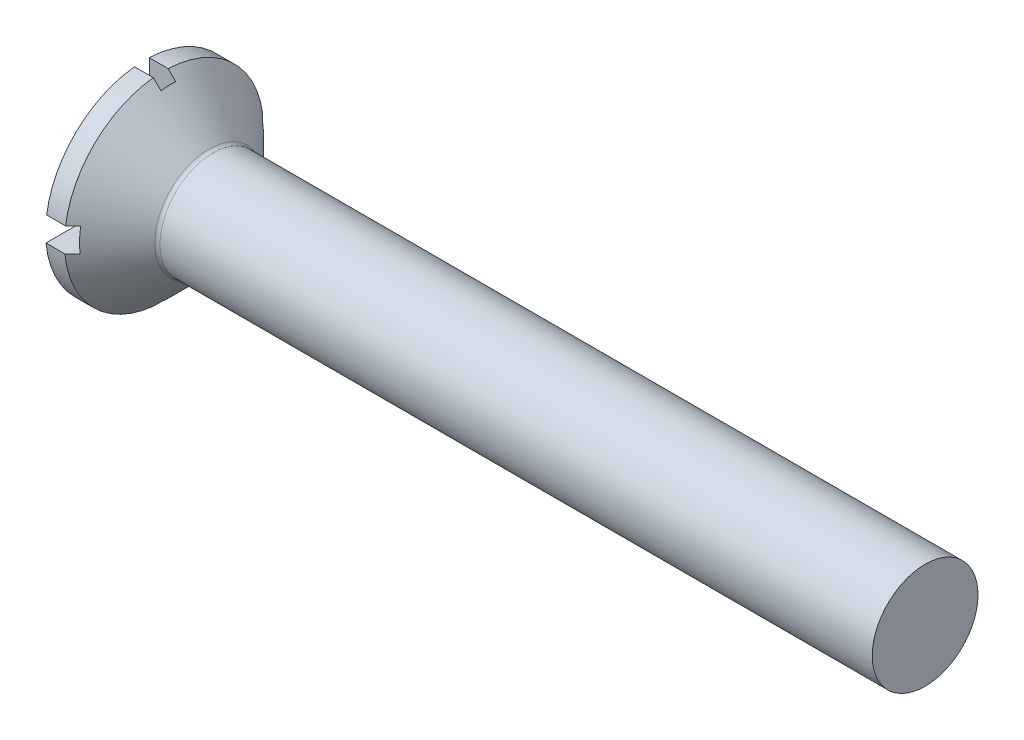
ISO-10303-21;
HEADER;
FILE_DESCRIPTION(('STEP AP214'),'2;1');
FILE_NAME('part.step','',(''),(''),'','','');
FILE_SCHEMA(('AUTOMOTIVE_DESIGN { 1 0 10303 214 1 1 1 1 }'));
ENDSEC;
DATA;
#1=APPLICATION_CONTEXT('core data for automotive mechanical design processes');
#2=APPLICATION_PROTOCOL_DEFINITION('international standard','automotive_design',2000,#1);
#3=PRODUCT_CONTEXT('',#1,'mechanical');
#4=PRODUCT('Part','Part','',(#3));
#5=PRODUCT_RELATED_PRODUCT_CATEGORY('part','',(#4));
#6=PRODUCT_DEFINITION_FORMATION('','',#4);
#7=PRODUCT_DEFINITION_CONTEXT('part definition',#1,'design');
#8=PRODUCT_DEFINITION('design','',#6,#7);
#9=PRODUCT_DEFINITION_SHAPE('','',#8);
#10=(LENGTH_UNIT() NAMED_UNIT(*) SI_UNIT(.MILLI.,.METRE.));
#11=(NAMED_UNIT(*) PLANE_ANGLE_UNIT() SI_UNIT($,.RADIAN.));
#12=(NAMED_UNIT(*) SI_UNIT($,.STERADIAN.) SOLID_ANGLE_UNIT());
#13=UNCERTAINTY_MEASURE_WITH_UNIT(LENGTH_MEASURE(1.E-05),#10,'distance_accuracy_value','');
#14=(GEOMETRIC_REPRESENTATION_CONTEXT(3) GLOBAL_UNCERTAINTY_ASSIGNED_CONTEXT((#13)) GLOBAL_UNIT_ASSIGNED_CONTEXT((#10,
#11,#12)) REPRESENTATION_CONTEXT('',''));
#15=CARTESIAN_POINT('',(0.,0.,0.));
#16=DIRECTION('',(0.,0.,1.));
#17=DIRECTION('',(1.,0.,0.));
#18=AXIS2_PLACEMENT_3D('',#15,#16,#17);
#19=CARTESIAN_POINT('',(-0.587069180985524,0.,0.));
#20=DIRECTION('',(-1.,0.,0.));
#21=DIRECTION('',(0.,0.,1.));
#22=AXIS2_PLACEMENT_3D('',#19,#20,#21);
#23=CYLINDRICAL_SURFACE('',#22,2.);
#24=CARTESIAN_POINT('',(2.56284271247462,0.,0.));
#25=DIRECTION('',(1.,0.,0.));
#26=DIRECTION('',(0.,0.,1.));
#27=AXIS2_PLACEMENT_3D('',#24,#25,#26);
#28=CIRCLE('',#27,2.);
#29=CARTESIAN_POINT('',(2.56284271247462,0.,2.));
#30=VERTEX_POINT('',#29);
#31=CARTESIAN_POINT('',(2.56284271247462,0.,-2.));
#32=VERTEX_POINT('',#31);
#33=EDGE_CURVE('E235',#30,#32,#28,.T.);
#34=ORIENTED_EDGE('',*,*,#33,.T.);
#35=DIRECTION('',(1.,0.,0.));
#36=VECTOR('',#35,1.);
#37=CARTESIAN_POINT('',(-0.587069180985524,0.,-2.));
#38=LINE('',#37,#36);
#39=CARTESIAN_POINT('',(29.5,0.,-2.));
#40=VERTEX_POINT('',#39);
#41=EDGE_CURVE('E11',#32,#40,#38,.T.);
#42=ORIENTED_EDGE('',*,*,#41,.T.);
#43=CARTESIAN_POINT('',(29.5,0.,0.));
#44=DIRECTION('',(-1.,0.,0.));
#45=DIRECTION('',(0.,0.,1.));
#46=AXIS2_PLACEMENT_3D('',#43,#44,#45);
#47=CIRCLE('',#46,2.);
#48=CARTESIAN_POINT('',(29.5,0.,2.));
#49=VERTEX_POINT('',#48);
#50=EDGE_CURVE('E276',#40,#49,#47,.T.);
#51=ORIENTED_EDGE('',*,*,#50,.T.);
#52=CARTESIAN_POINT('',(29.5,0.,0.));
#53=DIRECTION('',(-1.,0.,0.));
#54=DIRECTION('',(0.,0.,1.));
#55=AXIS2_PLACEMENT_3D('',#52,#53,#54);
#56=CIRCLE('',#55,2.);
#57=EDGE_CURVE('E272',#49,#40,#56,.T.);
#58=ORIENTED_EDGE('',*,*,#57,.T.);
#59=ORIENTED_EDGE('',*,*,#41,.F.);
#60=CARTESIAN_POINT('',(2.56284271247462,0.,0.));
#61=DIRECTION('',(1.,0.,0.));
#62=DIRECTION('',(0.,0.,1.));
#63=AXIS2_PLACEMENT_3D('',#60,#61,#62);
#64=CIRCLE('',#63,2.);
#65=EDGE_CURVE('E29',#32,#30,#64,.T.);
#66=ORIENTED_EDGE('',*,*,#65,.T.);
#67=EDGE_LOOP('',(#34,#42,#51,#58,#59,#66));
#68=FACE_BOUND('',#67,.T.);
#69=ADVANCED_FACE('F16',(#68),#23,.T.);
#70=CARTESIAN_POINT('',(2.56284271247462,0.,0.));
#71=DIRECTION('',(-1.,0.,0.));
#72=DIRECTION('',(0.,0.,1.));
#73=AXIS2_PLACEMENT_3D('',#70,#71,#72);
#74=TOROIDAL_SURFACE('',#73,2.2,0.2);
#75=CARTESIAN_POINT('',(2.42142135623731,0.,0.));
#76=DIRECTION('',(-1.,0.,0.));
#77=DIRECTION('',(0.,0.,-1.));
#78=AXIS2_PLACEMENT_3D('',#75,#76,#77);
#79=CIRCLE('',#78,2.05857864376269);
#80=CARTESIAN_POINT('',(2.42142135623731,0.,-2.05857864376269));
#81=VERTEX_POINT('',#80);
#82=EDGE_CURVE('E197',#81,#81,#79,.T.);
#83=ORIENTED_EDGE('',*,*,#82,.F.);
#84=CARTESIAN_POINT('',(2.56284271247462,0.,-2.2));
#85=DIRECTION('',(0.,1.,0.));
#86=DIRECTION('',(0.,0.,-1.));
#87=AXIS2_PLACEMENT_3D('',#84,#85,#86);
#88=CIRCLE('',#87,0.2);
#89=EDGE_CURVE('E237',#81,#32,#88,.T.);
#90=ORIENTED_EDGE('',*,*,#89,.T.);
#91=ORIENTED_EDGE('',*,*,#33,.F.);
#92=ORIENTED_EDGE('',*,*,#65,.F.);
#93=ORIENTED_EDGE('',*,*,#89,.F.);
#94=EDGE_LOOP('',(#83,#90,#91,#92,#93));
#95=FACE_BOUND('',#94,.T.);
#96=ADVANCED_FACE('F487',(#95),#74,.F.);
#97=CARTESIAN_POINT('',(29.5,0.,0.));
#98=DIRECTION('',(-1.,0.,0.));
#99=DIRECTION('',(0.,0.,1.));
#100=AXIS2_PLACEMENT_3D('',#97,#98,#99);
#101=PLANE('',#100);
#102=ORIENTED_EDGE('',*,*,#57,.F.);
#103=ORIENTED_EDGE('',*,*,#50,.F.);
#104=EDGE_LOOP('',(#102,#103));
#105=FACE_BOUND('',#104,.T.);
#106=ADVANCED_FACE('F492',(#105),#101,.F.);
#107=CARTESIAN_POINT('',(0.715000000070631,0.,0.));
#108=DIRECTION('',(-1.,0.,0.));
#109=DIRECTION('',(0.,0.,1.));
#110=AXIS2_PLACEMENT_3D('',#107,#108,#109);
#111=CONICAL_SURFACE('',#110,3.7649999999303,0.785398163397448);
#112=CARTESIAN_POINT('',(1.00000000000698,-0.355709243839867,3.46177280216434));
#113=CARTESIAN_POINT('',(0.905019064615649,-0.355709243839867,3.55725383863057));
#114=CARTESIAN_POINT('',(0.810017611375125,-0.355709243839867,3.65271446737118));
#115=CARTESIAN_POINT('',(0.715000000007098,-0.355709243839867,3.74815900593884));
#116=(BOUNDED_CURVE() B_SPLINE_CURVE(3,(#112,#113,#114,#115),.UNSPECIFIED.,.F.,
.F.) B_SPLINE_CURVE_WITH_KNOTS((4,4),(0.,0.000404032248356699),
.UNSPECIFIED.) CURVE() GEOMETRIC_REPRESENTATION_ITEM() RATIONAL_B_SPLINE_CURVE((1.,1.,1.,1.)) REPRESENTATION_ITEM(''));
#117=CARTESIAN_POINT('',(1.0000000000166,-0.355709243839867,3.46177280215467));
#118=VERTEX_POINT('',#117);
#119=CARTESIAN_POINT('',(0.715000000010443,-0.355709243839867,3.74815900594194));
#120=VERTEX_POINT('',#119);
#121=EDGE_CURVE('E99',#118,#120,#116,.T.);
#122=ORIENTED_EDGE('',*,*,#121,.T.);
#123=CARTESIAN_POINT('',(0.715000000013788,0.,0.));
#124=DIRECTION('',(1.,0.,0.));
#125=DIRECTION('',(0.,0.,-1.));
#126=AXIS2_PLACEMENT_3D('',#123,#124,#125);
#127=CIRCLE('',#126,3.76499999998714);
#128=CARTESIAN_POINT('',(0.715000000007358,-3.74335256782613,0.403158223159427));
#129=VERTEX_POINT('',#128);
#130=EDGE_CURVE('E199',#120,#129,#127,.T.);
#131=ORIENTED_EDGE('',*,*,#130,.T.);
#132=CARTESIAN_POINT('',(0.715000000003779,-3.74335256782973,0.403158223159427));
#133=CARTESIAN_POINT('',(0.810022715826608,-3.64778034517904,0.403158223159427));
#134=CARTESIAN_POINT('',(0.905024594312093,-3.55218739782545,0.403158223159427));
#135=CARTESIAN_POINT('',(1.00000000000697,-3.4565681603372,0.403158223159427));
#136=(BOUNDED_CURVE() B_SPLINE_CURVE(3,(#132,#133,#134,#135),.UNSPECIFIED.,.F.,
.F.) B_SPLINE_CURVE_WITH_KNOTS((4,4),(0.,0.000404314600753749),
.UNSPECIFIED.) CURVE() GEOMETRIC_REPRESENTATION_ITEM() RATIONAL_B_SPLINE_CURVE((1.,1.,1.,1.)) REPRESENTATION_ITEM(''));
#137=CARTESIAN_POINT('',(1.00000000002008,-3.456568160324,0.403158223159427));
#138=VERTEX_POINT('',#137);
#139=EDGE_CURVE('E269',#129,#138,#136,.T.);
#140=ORIENTED_EDGE('',*,*,#139,.T.);
#141=CARTESIAN_POINT('',(1.0000000000332,0.,0.));
#142=DIRECTION('',(-1.,0.,0.));
#143=DIRECTION('',(0.,0.,1.));
#144=AXIS2_PLACEMENT_3D('',#141,#142,#143);
#145=CIRCLE('',#144,3.47999999996773);
#146=CARTESIAN_POINT('',(1.0000000000166,-3.47646014463617,-0.156923110621762));
#147=VERTEX_POINT('',#146);
#148=EDGE_CURVE('E351',#147,#138,#145,.T.);
#149=ORIENTED_EDGE('',*,*,#148,.F.);
#150=CARTESIAN_POINT('',(1.00000000001678,-3.47646014463602,-0.156923110621761));
#151=CARTESIAN_POINT('',(0.863116145340617,-3.61348337932085,-0.156923110621761));
#152=CARTESIAN_POINT('',(0.71500000000726,-3.76172834443231,-0.156923110621761));
#153=(BOUNDED_CURVE() B_SPLINE_CURVE(2,(#150,#151,#152),.UNSPECIFIED.,.F.,
.F.) B_SPLINE_CURVE_WITH_KNOTS((3,3),(0.459731098107697,0.49001322674158),
.UNSPECIFIED.) CURVE() GEOMETRIC_REPRESENTATION_ITEM() RATIONAL_B_SPLINE_CURVE((1.14035854636428,
1.13219594789643,1.12234904023125)) REPRESENTATION_ITEM(''));
#154=CARTESIAN_POINT('',(0.715000000010455,-3.7617283444355,-0.156923110621762));
#155=VERTEX_POINT('',#154);
#156=EDGE_CURVE('E20',#147,#155,#153,.T.);
#157=ORIENTED_EDGE('',*,*,#156,.T.);
#158=CARTESIAN_POINT('',(0.715000000013788,0.,0.));
#159=DIRECTION('',(1.,0.,0.));
#160=DIRECTION('',(0.,0.,-1.));
#161=AXIS2_PLACEMENT_3D('',#158,#159,#160);
#162=CIRCLE('',#161,3.76499999998714);
#163=CARTESIAN_POINT('',(0.715000000007358,-0.355709243839861,-3.74815900593858));
#164=VERTEX_POINT('',#163);
#165=EDGE_CURVE('E253',#155,#164,#162,.T.);
#166=ORIENTED_EDGE('',*,*,#165,.T.);
#167=CARTESIAN_POINT('',(0.715000000003782,-0.355709243839861,-3.74815900594217));
#168=CARTESIAN_POINT('',(0.810017611372914,-0.355709243839861,-3.6527144673734));
#169=CARTESIAN_POINT('',(0.905019064614543,-0.355709243839861,-3.55725383863168));
#170=CARTESIAN_POINT('',(1.00000000000698,-0.355709243839861,-3.46177280216434));
#171=(BOUNDED_CURVE() B_SPLINE_CURVE(3,(#167,#168,#169,#170),.UNSPECIFIED.,.F.,
.F.) B_SPLINE_CURVE_WITH_KNOTS((4,4),(0.,0.00040403224836156),
.UNSPECIFIED.) CURVE() GEOMETRIC_REPRESENTATION_ITEM() RATIONAL_B_SPLINE_CURVE((1.,1.,1.,1.)) REPRESENTATION_ITEM(''));
#172=CARTESIAN_POINT('',(1.00000000002009,-0.355709243839861,-3.46177280215116));
#173=VERTEX_POINT('',#172);
#174=EDGE_CURVE('E204',#164,#173,#171,.T.);
#175=ORIENTED_EDGE('',*,*,#174,.T.);
#176=CARTESIAN_POINT('',(1.0000000000332,0.,0.));
#177=DIRECTION('',(-1.,0.,0.));
#178=DIRECTION('',(0.,0.,1.));
#179=AXIS2_PLACEMENT_3D('',#176,#177,#178);
#180=CIRCLE('',#179,3.47999999996773);
#181=CARTESIAN_POINT('',(1.0000000000332,0.,-3.47999999996773));
#182=VERTEX_POINT('',#181);
#183=EDGE_CURVE('E202',#182,#173,#180,.T.);
#184=ORIENTED_EDGE('',*,*,#183,.F.);
#185=DIRECTION('',(0.707106781186548,0.,0.707106781186548));
#186=VECTOR('',#185,1.);
#187=CARTESIAN_POINT('',(0.715000000070631,0.,-3.7649999999303));
#188=LINE('',#187,#186);
#189=EDGE_CURVE('E189',#182,#81,#188,.T.);
#190=ORIENTED_EDGE('',*,*,#189,.T.);
#191=ORIENTED_EDGE('',*,*,#82,.T.);
#192=ORIENTED_EDGE('',*,*,#189,.F.);
#193=CARTESIAN_POINT('',(1.0000000000332,0.,0.));
#194=DIRECTION('',(-1.,0.,0.));
#195=DIRECTION('',(0.,0.,1.));
#196=AXIS2_PLACEMENT_3D('',#193,#194,#195);
#197=CIRCLE('',#196,3.47999999996773);
#198=CARTESIAN_POINT('',(1.0000000000166,0.550618510763713,-3.4361634500552));
#199=VERTEX_POINT('',#198);
#200=EDGE_CURVE('E194',#199,#182,#197,.T.);
#201=ORIENTED_EDGE('',*,*,#200,.F.);
#202=CARTESIAN_POINT('',(1.00000000000693,0.550618510763713,-3.43616345006499));
#203=CARTESIAN_POINT('',(0.905046648429735,0.550618510763713,-3.53232816058883));
#204=CARTESIAN_POINT('',(0.810043057659697,0.550618510763712,-3.62844328041006));
#205=CARTESIAN_POINT('',(0.715000000007059,0.550618510763712,-3.72451933214988));
#206=(BOUNDED_CURVE() B_SPLINE_CURVE(3,(#202,#203,#204,#205),.UNSPECIFIED.,.F.,
.F.) B_SPLINE_CURVE_WITH_KNOTS((4,4),(0.,0.000405430776745857),
.UNSPECIFIED.) CURVE() GEOMETRIC_REPRESENTATION_ITEM() RATIONAL_B_SPLINE_CURVE((1.,1.,1.,1.)) REPRESENTATION_ITEM(''));
#207=CARTESIAN_POINT('',(0.715000000010424,0.550618510763712,-3.72451933215298));
#208=VERTEX_POINT('',#207);
#209=EDGE_CURVE('E290',#199,#208,#206,.T.);
#210=ORIENTED_EDGE('',*,*,#209,.T.);
#211=CARTESIAN_POINT('',(0.715000000013788,0.,0.));
#212=DIRECTION('',(1.,0.,0.));
#213=DIRECTION('',(0.,0.,-1.));
#214=AXIS2_PLACEMENT_3D('',#211,#212,#213);
#215=CIRCLE('',#214,3.76499999998714);
#216=CARTESIAN_POINT('',(0.715000000007359,3.76172834443217,-0.156923110621762));
#217=VERTEX_POINT('',#216);
#218=EDGE_CURVE('E364',#208,#217,#215,.T.);
#219=ORIENTED_EDGE('',*,*,#218,.T.);
#220=CARTESIAN_POINT('',(0.715000000007381,3.76172834443219,-0.156923110621762));
#221=CARTESIAN_POINT('',(0.863116145342566,3.6134833793189,-0.156923110621762));
#222=CARTESIAN_POINT('',(1.00000000002029,3.47646014463252,-0.156923110621761));
#223=(BOUNDED_CURVE() B_SPLINE_CURVE(2,(#220,#221,#222),.UNSPECIFIED.,.F.,
.F.) B_SPLINE_CURVE_WITH_KNOTS((3,3),(0.135938897592142,0.166221026226403),
.UNSPECIFIED.) CURVE() GEOMETRIC_REPRESENTATION_ITEM() RATIONAL_B_SPLINE_CURVE((1.12234904023126,
1.13219594789656,1.14035854636449)) REPRESENTATION_ITEM(''));
#224=CARTESIAN_POINT('',(1.0000000000201,3.47646014463266,-0.156923110621762));
#225=VERTEX_POINT('',#224);
#226=EDGE_CURVE('E282',#217,#225,#223,.T.);
#227=ORIENTED_EDGE('',*,*,#226,.T.);
#228=CARTESIAN_POINT('',(1.0000000000332,0.,0.));
#229=DIRECTION('',(-1.,0.,0.));
#230=DIRECTION('',(0.,0.,1.));
#231=AXIS2_PLACEMENT_3D('',#228,#229,#230);
#232=CIRCLE('',#231,3.47999999996773);
#233=CARTESIAN_POINT('',(1.0000000000166,3.4565681603275,0.403158223159424));
#234=VERTEX_POINT('',#233);
#235=EDGE_CURVE('E350',#234,#225,#232,.T.);
#236=ORIENTED_EDGE('',*,*,#235,.F.);
#237=CARTESIAN_POINT('',(1.00000000000697,3.4565681603372,0.403158223159424));
#238=CARTESIAN_POINT('',(0.905024594313196,3.55218739782434,0.403158223159424));
#239=CARTESIAN_POINT('',(0.810022715828815,3.64778034517682,0.403158223159424));
#240=CARTESIAN_POINT('',(0.715000000007091,3.7433525678264,0.403158223159424));
#241=(BOUNDED_CURVE() B_SPLINE_CURVE(3,(#237,#238,#239,#240),.UNSPECIFIED.,.F.,
.F.) B_SPLINE_CURVE_WITH_KNOTS((4,4),(0.,0.00040431460074889),
.UNSPECIFIED.) CURVE() GEOMETRIC_REPRESENTATION_ITEM() RATIONAL_B_SPLINE_CURVE((1.,1.,1.,1.)) REPRESENTATION_ITEM(''));
#242=CARTESIAN_POINT('',(0.715000000010439,3.7433525678295,0.403158223159424));
#243=VERTEX_POINT('',#242);
#244=EDGE_CURVE('E281',#234,#243,#241,.T.);
#245=ORIENTED_EDGE('',*,*,#244,.T.);
#246=CARTESIAN_POINT('',(0.715000000013788,0.,0.));
#247=DIRECTION('',(1.,0.,0.));
#248=DIRECTION('',(0.,0.,-1.));
#249=AXIS2_PLACEMENT_3D('',#246,#247,#248);
#250=CIRCLE('',#249,3.76499999998714);
#251=CARTESIAN_POINT('',(0.715000000007359,0.550618510763713,3.72451933214958));
#252=VERTEX_POINT('',#251);
#253=EDGE_CURVE('E361',#243,#252,#250,.T.);
#254=ORIENTED_EDGE('',*,*,#253,.T.);
#255=CARTESIAN_POINT('',(0.715000000003765,0.550618510763713,3.72451933215321));
#256=CARTESIAN_POINT('',(0.810043057657502,0.550618510763713,3.62844328041228));
#257=CARTESIAN_POINT('',(0.905046648428638,0.550618510763713,3.53232816058994));
#258=CARTESIAN_POINT('',(1.00000000000693,0.550618510763713,3.43616345006499));
#259=(BOUNDED_CURVE() B_SPLINE_CURVE(3,(#255,#256,#257,#258),.UNSPECIFIED.,.F.,
.F.) B_SPLINE_CURVE_WITH_KNOTS((4,4),(0.,0.000405430776750704),
.UNSPECIFIED.) CURVE() GEOMETRIC_REPRESENTATION_ITEM() RATIONAL_B_SPLINE_CURVE((1.,1.,1.,1.)) REPRESENTATION_ITEM(''));
#260=CARTESIAN_POINT('',(1.00000000002006,0.550618510763713,3.43616345005169));
#261=VERTEX_POINT('',#260);
#262=EDGE_CURVE('E82',#252,#261,#259,.T.);
#263=ORIENTED_EDGE('',*,*,#262,.T.);
#264=CARTESIAN_POINT('',(1.0000000000332,0.,0.));
#265=DIRECTION('',(-1.,0.,0.));
#266=DIRECTION('',(0.,0.,1.));
#267=AXIS2_PLACEMENT_3D('',#264,#265,#266);
#268=CIRCLE('',#267,3.47999999996773);
#269=EDGE_CURVE('E243',#118,#261,#268,.T.);
#270=ORIENTED_EDGE('',*,*,#269,.F.);
#271=EDGE_LOOP('',(#122,#131,#140,#149,#157,#166,#175,#184,#190,#191,#192,#201,#210,#219,#227,
#236,#245,#254,#263,#270));
#272=FACE_BOUND('',#271,.T.);
#273=ADVANCED_FACE('F191',(#272),#111,.T.);
#274=CARTESIAN_POINT('',(11.8531386861314,0.,0.));
#275=DIRECTION('',(1.,0.,0.));
#276=DIRECTION('',(0.,0.,-1.));
#277=AXIS2_PLACEMENT_3D('',#274,#275,#276);
#278=CYLINDRICAL_SURFACE('',#277,3.765);
#279=DIRECTION('',(-1.,0.,0.));
#280=VECTOR('',#279,1.);
#281=CARTESIAN_POINT('',(0.,-0.355709243839867,3.74815900594503));
#282=LINE('',#281,#280);
#283=CARTESIAN_POINT('',(0.,-0.355709243839866,3.74815900594503));
#284=VERTEX_POINT('',#283);
#285=EDGE_CURVE('E270',#120,#284,#282,.T.);
#286=ORIENTED_EDGE('',*,*,#285,.T.);
#287=CARTESIAN_POINT('',(0.,0.,0.));
#288=DIRECTION('',(1.,0.,0.));
#289=DIRECTION('',(0.,0.,-1.));
#290=AXIS2_PLACEMENT_3D('',#287,#288,#289);
#291=CIRCLE('',#290,3.765);
#292=CARTESIAN_POINT('',(0.,-3.7433525678326,0.403158223159427));
#293=VERTEX_POINT('',#292);
#294=EDGE_CURVE('E374',#284,#293,#291,.T.);
#295=ORIENTED_EDGE('',*,*,#294,.T.);
#296=DIRECTION('',(1.,0.,0.));
#297=VECTOR('',#296,1.);
#298=CARTESIAN_POINT('',(0.,-3.7433525678326,0.403158223159427));
#299=LINE('',#298,#297);
#300=EDGE_CURVE('E325',#293,#129,#299,.T.);
#301=ORIENTED_EDGE('',*,*,#300,.T.);
#302=ORIENTED_EDGE('',*,*,#130,.F.);
#303=EDGE_LOOP('',(#286,#295,#301,#302));
#304=FACE_BOUND('',#303,.T.);
#305=ADVANCED_FACE('F450',(#304),#278,.T.);
#306=CARTESIAN_POINT('',(11.8531386861314,0.,0.));
#307=DIRECTION('',(1.,0.,0.));
#308=DIRECTION('',(0.,0.,-1.));
#309=AXIS2_PLACEMENT_3D('',#306,#307,#308);
#310=CYLINDRICAL_SURFACE('',#309,3.765);
#311=DIRECTION('',(-1.,0.,0.));
#312=VECTOR('',#311,1.);
#313=CARTESIAN_POINT('',(0.715000000010455,-3.7617283444386,-0.156923110621762));
#314=LINE('',#313,#312);
#315=CARTESIAN_POINT('',(0.,-3.7617283444386,-0.156923110621762));
#316=VERTEX_POINT('',#315);
#317=EDGE_CURVE('E249',#155,#316,#314,.T.);
#318=ORIENTED_EDGE('',*,*,#317,.T.);
#319=CARTESIAN_POINT('',(0.,0.,0.));
#320=DIRECTION('',(1.,0.,0.));
#321=DIRECTION('',(0.,0.,-1.));
#322=AXIS2_PLACEMENT_3D('',#319,#320,#321);
#323=CIRCLE('',#322,3.765);
#324=CARTESIAN_POINT('',(0.,-0.355709243839861,-3.74815900594504));
#325=VERTEX_POINT('',#324);
#326=EDGE_CURVE('E371',#316,#325,#323,.T.);
#327=ORIENTED_EDGE('',*,*,#326,.T.);
#328=DIRECTION('',(1.,0.,0.));
#329=VECTOR('',#328,1.);
#330=CARTESIAN_POINT('',(0.,-0.355709243839861,-3.74815900594503));
#331=LINE('',#330,#329);
#332=EDGE_CURVE('E330',#325,#164,#331,.T.);
#333=ORIENTED_EDGE('',*,*,#332,.T.);
#334=ORIENTED_EDGE('',*,*,#165,.F.);
#335=EDGE_LOOP('',(#318,#327,#333,#334));
#336=FACE_BOUND('',#335,.T.);
#337=ADVANCED_FACE('F463',(#336),#310,.T.);
#338=CARTESIAN_POINT('',(11.8531386861314,0.,0.));
#339=DIRECTION('',(1.,0.,0.));
#340=DIRECTION('',(0.,0.,-1.));
#341=AXIS2_PLACEMENT_3D('',#338,#339,#340);
#342=CYLINDRICAL_SURFACE('',#341,3.765);
#343=DIRECTION('',(-1.,0.,0.));
#344=VECTOR('',#343,1.);
#345=CARTESIAN_POINT('',(0.,3.7433525678326,0.403158223159424));
#346=LINE('',#345,#344);
#347=CARTESIAN_POINT('',(0.,3.7433525678326,0.403158223159424));
#348=VERTEX_POINT('',#347);
#349=EDGE_CURVE('E319',#243,#348,#346,.T.);
#350=ORIENTED_EDGE('',*,*,#349,.T.);
#351=CARTESIAN_POINT('',(0.,0.,0.));
#352=DIRECTION('',(1.,0.,0.));
#353=DIRECTION('',(0.,0.,-1.));
#354=AXIS2_PLACEMENT_3D('',#351,#352,#353);
#355=CIRCLE('',#354,3.765);
#356=CARTESIAN_POINT('',(0.,0.550618510763713,3.72451933215608));
#357=VERTEX_POINT('',#356);
#358=EDGE_CURVE('E324',#348,#357,#355,.T.);
#359=ORIENTED_EDGE('',*,*,#358,.T.);
#360=DIRECTION('',(1.,0.,0.));
#361=VECTOR('',#360,1.);
#362=CARTESIAN_POINT('',(0.,0.550618510763713,3.72451933215608));
#363=LINE('',#362,#361);
#364=EDGE_CURVE('E258',#357,#252,#363,.T.);
#365=ORIENTED_EDGE('',*,*,#364,.T.);
#366=ORIENTED_EDGE('',*,*,#253,.F.);
#367=EDGE_LOOP('',(#350,#359,#365,#366));
#368=FACE_BOUND('',#367,.T.);
#369=ADVANCED_FACE('F531',(#368),#342,.T.);
#370=CARTESIAN_POINT('',(11.8531386861314,0.,0.));
#371=DIRECTION('',(1.,0.,0.));
#372=DIRECTION('',(0.,0.,-1.));
#373=AXIS2_PLACEMENT_3D('',#370,#371,#372);
#374=CYLINDRICAL_SURFACE('',#373,3.765);
#375=DIRECTION('',(-1.,0.,0.));
#376=VECTOR('',#375,1.);
#377=CARTESIAN_POINT('',(0.,0.550618510763712,-3.72451933215608));
#378=LINE('',#377,#376);
#379=CARTESIAN_POINT('',(0.,0.550618510763712,-3.72451933215608));
#380=VERTEX_POINT('',#379);
#381=EDGE_CURVE('E229',#208,#380,#378,.T.);
#382=ORIENTED_EDGE('',*,*,#381,.T.);
#383=CARTESIAN_POINT('',(0.,0.,0.));
#384=DIRECTION('',(1.,0.,0.));
#385=DIRECTION('',(0.,0.,-1.));
#386=AXIS2_PLACEMENT_3D('',#383,#384,#385);
#387=CIRCLE('',#386,3.765);
#388=CARTESIAN_POINT('',(0.,3.7617283444386,-0.156923110621762));
#389=VERTEX_POINT('',#388);
#390=EDGE_CURVE('E320',#380,#389,#387,.T.);
#391=ORIENTED_EDGE('',*,*,#390,.T.);
#392=DIRECTION('',(1.,0.,0.));
#393=VECTOR('',#392,1.);
#394=CARTESIAN_POINT('',(0.715000000007359,3.7617283444386,-0.156923110621762));
#395=LINE('',#394,#393);
#396=EDGE_CURVE('E277',#389,#217,#395,.T.);
#397=ORIENTED_EDGE('',*,*,#396,.T.);
#398=ORIENTED_EDGE('',*,*,#218,.F.);
#399=EDGE_LOOP('',(#382,#391,#397,#398));
#400=FACE_BOUND('',#399,.T.);
#401=ADVANCED_FACE('F482',(#400),#374,.T.);
#402=CARTESIAN_POINT('',(0.,0.,0.));
#403=DIRECTION('',(1.,0.,0.));
#404=DIRECTION('',(0.,1.,0.));
#405=AXIS2_PLACEMENT_3D('',#402,#403,#404);
#406=PLANE('',#405);
#407=ORIENTED_EDGE('',*,*,#294,.F.);
#408=DIRECTION('',(0.,0.,1.));
#409=VECTOR('',#408,1.);
#410=CARTESIAN_POINT('',(0.,-0.355709243839864,3.74815900594503));
#411=LINE('',#410,#409);
#412=CARTESIAN_POINT('',(0.,-0.355709243839864,0.403158223159426));
#413=VERTEX_POINT('',#412);
#414=EDGE_CURVE('E343',#413,#284,#411,.T.);
#415=ORIENTED_EDGE('',*,*,#414,.F.);
#416=DIRECTION('',(0.,1.,0.));
#417=VECTOR('',#416,1.);
#418=CARTESIAN_POINT('',(0.,-3.7433525678326,0.403158223159427));
#419=LINE('',#418,#417);
#420=EDGE_CURVE('E267',#293,#413,#419,.T.);
#421=ORIENTED_EDGE('',*,*,#420,.F.);
#422=EDGE_LOOP('',(#407,#415,#421));
#423=FACE_BOUND('',#422,.T.);
#424=ADVANCED_FACE('F456',(#423),#406,.F.);
#425=CARTESIAN_POINT('',(0.,0.,0.));
#426=DIRECTION('',(1.,0.,0.));
#427=DIRECTION('',(0.,1.,0.));
#428=AXIS2_PLACEMENT_3D('',#425,#426,#427);
#429=PLANE('',#428);
#430=ORIENTED_EDGE('',*,*,#326,.F.);
#431=DIRECTION('',(0.,-1.,0.));
#432=VECTOR('',#431,1.);
#433=CARTESIAN_POINT('',(0.,-3.7617283444386,-0.156923110621762));
#434=LINE('',#433,#432);
#435=CARTESIAN_POINT('',(0.,-0.355709243839862,-0.156923110621762));
#436=VERTEX_POINT('',#435);
#437=EDGE_CURVE('E245',#436,#316,#434,.T.);
#438=ORIENTED_EDGE('',*,*,#437,.F.);
#439=DIRECTION('',(0.,0.,1.));
#440=VECTOR('',#439,1.);
#441=CARTESIAN_POINT('',(0.,-0.355709243839861,-0.156923110621762));
#442=LINE('',#441,#440);
#443=EDGE_CURVE('E313',#325,#436,#442,.T.);
#444=ORIENTED_EDGE('',*,*,#443,.F.);
#445=EDGE_LOOP('',(#430,#438,#444));
#446=FACE_BOUND('',#445,.T.);
#447=ADVANCED_FACE('F470',(#446),#429,.F.);
#448=CARTESIAN_POINT('',(0.,0.,0.));
#449=DIRECTION('',(1.,0.,0.));
#450=DIRECTION('',(0.,1.,0.));
#451=AXIS2_PLACEMENT_3D('',#448,#449,#450);
#452=PLANE('',#451);
#453=ORIENTED_EDGE('',*,*,#358,.F.);
#454=DIRECTION('',(0.,1.,0.));
#455=VECTOR('',#454,1.);
#456=CARTESIAN_POINT('',(0.,0.550618510763713,0.403158223159425));
#457=LINE('',#456,#455);
#458=CARTESIAN_POINT('',(0.,0.550618510763713,0.403158223159425));
#459=VERTEX_POINT('',#458);
#460=EDGE_CURVE('E342',#459,#348,#457,.T.);
#461=ORIENTED_EDGE('',*,*,#460,.F.);
#462=DIRECTION('',(0.,0.,-1.));
#463=VECTOR('',#462,1.);
#464=CARTESIAN_POINT('',(0.,0.550618510763713,3.72451933215608));
#465=LINE('',#464,#463);
#466=EDGE_CURVE('E259',#357,#459,#465,.T.);
#467=ORIENTED_EDGE('',*,*,#466,.F.);
#468=EDGE_LOOP('',(#453,#461,#467));
#469=FACE_BOUND('',#468,.T.);
#470=ADVANCED_FACE('F472',(#469),#452,.F.);
#471=CARTESIAN_POINT('',(0.,0.,0.));
#472=DIRECTION('',(1.,0.,0.));
#473=DIRECTION('',(0.,1.,0.));
#474=AXIS2_PLACEMENT_3D('',#471,#472,#473);
#475=PLANE('',#474);
#476=ORIENTED_EDGE('',*,*,#390,.F.);
#477=DIRECTION('',(0.,0.,-1.));
#478=VECTOR('',#477,1.);
#479=CARTESIAN_POINT('',(0.,0.550618510763712,-0.156923110621762));
#480=LINE('',#479,#478);
#481=CARTESIAN_POINT('',(0.,0.550618510763712,-0.156923110621762));
#482=VERTEX_POINT('',#481);
#483=EDGE_CURVE('E234',#482,#380,#480,.T.);
#484=ORIENTED_EDGE('',*,*,#483,.F.);
#485=DIRECTION('',(0.,-1.,0.));
#486=VECTOR('',#485,1.);
#487=CARTESIAN_POINT('',(0.,0.550618510763712,-0.156923110621762));
#488=LINE('',#487,#486);
#489=EDGE_CURVE('E233',#389,#482,#488,.T.);
#490=ORIENTED_EDGE('',*,*,#489,.F.);
#491=EDGE_LOOP('',(#476,#484,#490));
#492=FACE_BOUND('',#491,.T.);
#493=ADVANCED_FACE('F479',(#492),#475,.F.);
#494=CARTESIAN_POINT('',(1.,-4.05674824255773,0.403158223159427));
#495=DIRECTION('',(0.,0.,1.));
#496=DIRECTION('',(0.,-1.,0.));
#497=AXIS2_PLACEMENT_3D('',#494,#495,#496);
#498=PLANE('',#497);
#499=ORIENTED_EDGE('',*,*,#420,.T.);
#500=DIRECTION('',(-1.,0.,0.));
#501=VECTOR('',#500,1.);
#502=CARTESIAN_POINT('',(0.,-0.355709243839864,0.403158223159425));
#503=LINE('',#502,#501);
#504=CARTESIAN_POINT('',(1.,-0.355709243839864,0.403158223159425));
#505=VERTEX_POINT('',#504);
#506=EDGE_CURVE('E347',#505,#413,#503,.T.);
#507=ORIENTED_EDGE('',*,*,#506,.F.);
#508=DIRECTION('',(0.,1.,0.));
#509=VECTOR('',#508,1.);
#510=CARTESIAN_POINT('',(1.,-0.355709243839864,0.403158223159425));
#511=LINE('',#510,#509);
#512=EDGE_CURVE('E244',#138,#505,#511,.T.);
#513=ORIENTED_EDGE('',*,*,#512,.F.);
#514=ORIENTED_EDGE('',*,*,#139,.F.);
#515=ORIENTED_EDGE('',*,*,#300,.F.);
#516=EDGE_LOOP('',(#499,#507,#513,#514,#515));
#517=FACE_BOUND('',#516,.T.);
#518=ADVANCED_FACE('F455',(#517),#498,.F.);
#519=CARTESIAN_POINT('',(1.,-0.355709243839865,0.403158223159425));
#520=DIRECTION('',(0.,-1.,0.));
#521=DIRECTION('',(0.,0.,-1.));
#522=AXIS2_PLACEMENT_3D('',#519,#520,#521);
#523=PLANE('',#522);
#524=ORIENTED_EDGE('',*,*,#121,.F.);
#525=DIRECTION('',(0.,0.,1.));
#526=VECTOR('',#525,1.);
#527=CARTESIAN_POINT('',(1.,-0.355709243839867,3.46177280215467));
#528=LINE('',#527,#526);
#529=EDGE_CURVE('E239',#505,#118,#528,.T.);
#530=ORIENTED_EDGE('',*,*,#529,.F.);
#531=ORIENTED_EDGE('',*,*,#506,.T.);
#532=ORIENTED_EDGE('',*,*,#414,.T.);
#533=ORIENTED_EDGE('',*,*,#285,.F.);
#534=EDGE_LOOP('',(#524,#530,#531,#532,#533));
#535=FACE_BOUND('',#534,.T.);
#536=ADVANCED_FACE('F457',(#535),#523,.F.);
#537=CARTESIAN_POINT('',(1.,-0.355709243839861,-4.09236224952616));
#538=DIRECTION('',(0.,-1.,0.));
#539=DIRECTION('',(0.,0.,-1.));
#540=AXIS2_PLACEMENT_3D('',#537,#538,#539);
#541=PLANE('',#540);
#542=ORIENTED_EDGE('',*,*,#443,.T.);
#543=DIRECTION('',(-1.,0.,0.));
#544=VECTOR('',#543,1.);
#545=CARTESIAN_POINT('',(0.,-0.355709243839864,-0.156923110621762));
#546=LINE('',#545,#544);
#547=CARTESIAN_POINT('',(1.,-0.355709243839864,-0.156923110621762));
#548=VERTEX_POINT('',#547);
#549=EDGE_CURVE('E250',#548,#436,#546,.T.);
#550=ORIENTED_EDGE('',*,*,#549,.F.);
#551=DIRECTION('',(0.,0.,1.));
#552=VECTOR('',#551,1.);
#553=CARTESIAN_POINT('',(1.,-0.355709243839864,-0.156923110621762));
#554=LINE('',#553,#552);
#555=EDGE_CURVE('E209',#173,#548,#554,.T.);
#556=ORIENTED_EDGE('',*,*,#555,.F.);
#557=ORIENTED_EDGE('',*,*,#174,.F.);
#558=ORIENTED_EDGE('',*,*,#332,.F.);
#559=EDGE_LOOP('',(#542,#550,#556,#557,#558));
#560=FACE_BOUND('',#559,.T.);
#561=ADVANCED_FACE('F18',(#560),#541,.F.);
#562=CARTESIAN_POINT('',(1.,-0.355709243839864,-0.156923110621762));
#563=DIRECTION('',(0.,0.,-1.));
#564=DIRECTION('',(0.,-1.,0.));
#565=AXIS2_PLACEMENT_3D('',#562,#563,#564);
#566=PLANE('',#565);
#567=ORIENTED_EDGE('',*,*,#156,.F.);
#568=DIRECTION('',(0.,-1.,0.));
#569=VECTOR('',#568,1.);
#570=CARTESIAN_POINT('',(1.,-3.47646014463617,-0.156923110621762));
#571=LINE('',#570,#569);
#572=EDGE_CURVE('E355',#548,#147,#571,.T.);
#573=ORIENTED_EDGE('',*,*,#572,.F.);
#574=ORIENTED_EDGE('',*,*,#549,.T.);
#575=ORIENTED_EDGE('',*,*,#437,.T.);
#576=ORIENTED_EDGE('',*,*,#317,.F.);
#577=EDGE_LOOP('',(#567,#573,#574,#575,#576));
#578=FACE_BOUND('',#577,.T.);
#579=ADVANCED_FACE('F458',(#578),#566,.F.);
#580=CARTESIAN_POINT('',(1.,0.550618510763713,4.40763775047384));
#581=DIRECTION('',(0.,1.,0.));
#582=DIRECTION('',(0.,0.,-1.));
#583=AXIS2_PLACEMENT_3D('',#580,#581,#582);
#584=PLANE('',#583);
#585=ORIENTED_EDGE('',*,*,#466,.T.);
#586=DIRECTION('',(-1.,0.,0.));
#587=VECTOR('',#586,1.);
#588=CARTESIAN_POINT('',(0.,0.550618510763712,0.403158223159425));
#589=LINE('',#588,#587);
#590=CARTESIAN_POINT('',(1.,0.550618510763712,0.403158223159425));
#591=VERTEX_POINT('',#590);
#592=EDGE_CURVE('E382',#591,#459,#589,.T.);
#593=ORIENTED_EDGE('',*,*,#592,.F.);
#594=DIRECTION('',(0.,0.,-1.));
#595=VECTOR('',#594,1.);
#596=CARTESIAN_POINT('',(1.,0.550618510763712,0.403158223159425));
#597=LINE('',#596,#595);
#598=EDGE_CURVE('E266',#261,#591,#597,.T.);
#599=ORIENTED_EDGE('',*,*,#598,.F.);
#600=ORIENTED_EDGE('',*,*,#262,.F.);
#601=ORIENTED_EDGE('',*,*,#364,.F.);
#602=EDGE_LOOP('',(#585,#593,#599,#600,#601));
#603=FACE_BOUND('',#602,.T.);
#604=ADVANCED_FACE('F612',(#603),#584,.F.);
#605=CARTESIAN_POINT('',(1.,0.550618510763713,0.403158223159425));
#606=DIRECTION('',(0.,0.,1.));
#607=DIRECTION('',(0.,-1.,0.));
#608=AXIS2_PLACEMENT_3D('',#605,#606,#607);
#609=PLANE('',#608);
#610=ORIENTED_EDGE('',*,*,#244,.F.);
#611=DIRECTION('',(0.,1.,0.));
#612=VECTOR('',#611,1.);
#613=CARTESIAN_POINT('',(1.,3.4565681603275,0.403158223159424));
#614=LINE('',#613,#612);
#615=EDGE_CURVE('E286',#591,#234,#614,.T.);
#616=ORIENTED_EDGE('',*,*,#615,.F.);
#617=ORIENTED_EDGE('',*,*,#592,.T.);
#618=ORIENTED_EDGE('',*,*,#460,.T.);
#619=ORIENTED_EDGE('',*,*,#349,.F.);
#620=EDGE_LOOP('',(#610,#616,#617,#618,#619));
#621=FACE_BOUND('',#620,.T.);
#622=ADVANCED_FACE('F509',(#621),#609,.F.);
#623=CARTESIAN_POINT('',(1.,4.34325175744227,-0.156923110621762));
#624=DIRECTION('',(0.,0.,-1.));
#625=DIRECTION('',(0.,-1.,0.));
#626=AXIS2_PLACEMENT_3D('',#623,#624,#625);
#627=PLANE('',#626);
#628=ORIENTED_EDGE('',*,*,#489,.T.);
#629=DIRECTION('',(-1.,0.,0.));
#630=VECTOR('',#629,1.);
#631=CARTESIAN_POINT('',(1.,0.550618510763712,-0.156923110621762));
#632=LINE('',#631,#630);
#633=CARTESIAN_POINT('',(1.,0.550618510763712,-0.156923110621762));
#634=VERTEX_POINT('',#633);
#635=EDGE_CURVE('E287',#634,#482,#632,.T.);
#636=ORIENTED_EDGE('',*,*,#635,.F.);
#637=DIRECTION('',(0.,-1.,0.));
#638=VECTOR('',#637,1.);
#639=CARTESIAN_POINT('',(1.,0.550618510763712,-0.156923110621762));
#640=LINE('',#639,#638);
#641=EDGE_CURVE('E222',#225,#634,#640,.T.);
#642=ORIENTED_EDGE('',*,*,#641,.F.);
#643=ORIENTED_EDGE('',*,*,#226,.F.);
#644=ORIENTED_EDGE('',*,*,#396,.F.);
#645=EDGE_LOOP('',(#628,#636,#642,#643,#644));
#646=FACE_BOUND('',#645,.T.);
#647=ADVANCED_FACE('F506',(#646),#627,.F.);
#648=CARTESIAN_POINT('',(1.,0.550618510763713,-0.156923110621761));
#649=DIRECTION('',(0.,1.,0.));
#650=DIRECTION('',(0.,0.,-1.));
#651=AXIS2_PLACEMENT_3D('',#648,#649,#650);
#652=PLANE('',#651);
#653=ORIENTED_EDGE('',*,*,#209,.F.);
#654=DIRECTION('',(0.,0.,-1.));
#655=VECTOR('',#654,1.);
#656=CARTESIAN_POINT('',(1.,0.550618510763713,-3.4361634500552));
#657=LINE('',#656,#655);
#658=EDGE_CURVE('E215',#634,#199,#657,.T.);
#659=ORIENTED_EDGE('',*,*,#658,.F.);
#660=ORIENTED_EDGE('',*,*,#635,.T.);
#661=ORIENTED_EDGE('',*,*,#483,.T.);
#662=ORIENTED_EDGE('',*,*,#381,.F.);
#663=EDGE_LOOP('',(#653,#659,#660,#661,#662));
#664=FACE_BOUND('',#663,.T.);
#665=ADVANCED_FACE('F508',(#664),#652,.F.);
#666=CARTESIAN_POINT('',(1.,0.,0.));
#667=DIRECTION('',(-1.,0.,0.));
#668=DIRECTION('',(0.,0.,1.));
#669=AXIS2_PLACEMENT_3D('',#666,#667,#668);
#670=PLANE('',#669);
#671=ORIENTED_EDGE('',*,*,#572,.T.);
#672=ORIENTED_EDGE('',*,*,#148,.T.);
#673=ORIENTED_EDGE('',*,*,#512,.T.);
#674=ORIENTED_EDGE('',*,*,#529,.T.);
#675=ORIENTED_EDGE('',*,*,#269,.T.);
#676=ORIENTED_EDGE('',*,*,#598,.T.);
#677=ORIENTED_EDGE('',*,*,#615,.T.);
#678=ORIENTED_EDGE('',*,*,#235,.T.);
#679=ORIENTED_EDGE('',*,*,#641,.T.);
#680=ORIENTED_EDGE('',*,*,#658,.T.);
#681=ORIENTED_EDGE('',*,*,#200,.T.);
#682=ORIENTED_EDGE('',*,*,#183,.T.);
#683=ORIENTED_EDGE('',*,*,#555,.T.);
#684=EDGE_LOOP('',(#671,#672,#673,#674,#675,#676,#677,#678,#679,#680,#681,#682,#683));
#685=FACE_BOUND('',#684,.T.);
#686=ADVANCED_FACE('F212',(#685),#670,.T.);
#687=CLOSED_SHELL('',(#69,#96,#106,#273,#305,#337,#369,#401,#424,#447,#470,#493,#518,#536,#561,
#579,#604,#622,#647,#665,#686));
#688=MANIFOLD_SOLID_BREP('B1',#687);
#689=ADVANCED_BREP_SHAPE_REPRESENTATION('',(#18,#688),#14);
#690=SHAPE_DEFINITION_REPRESENTATION(#9,#689);
ENDSEC;
END-ISO-10303-21;
